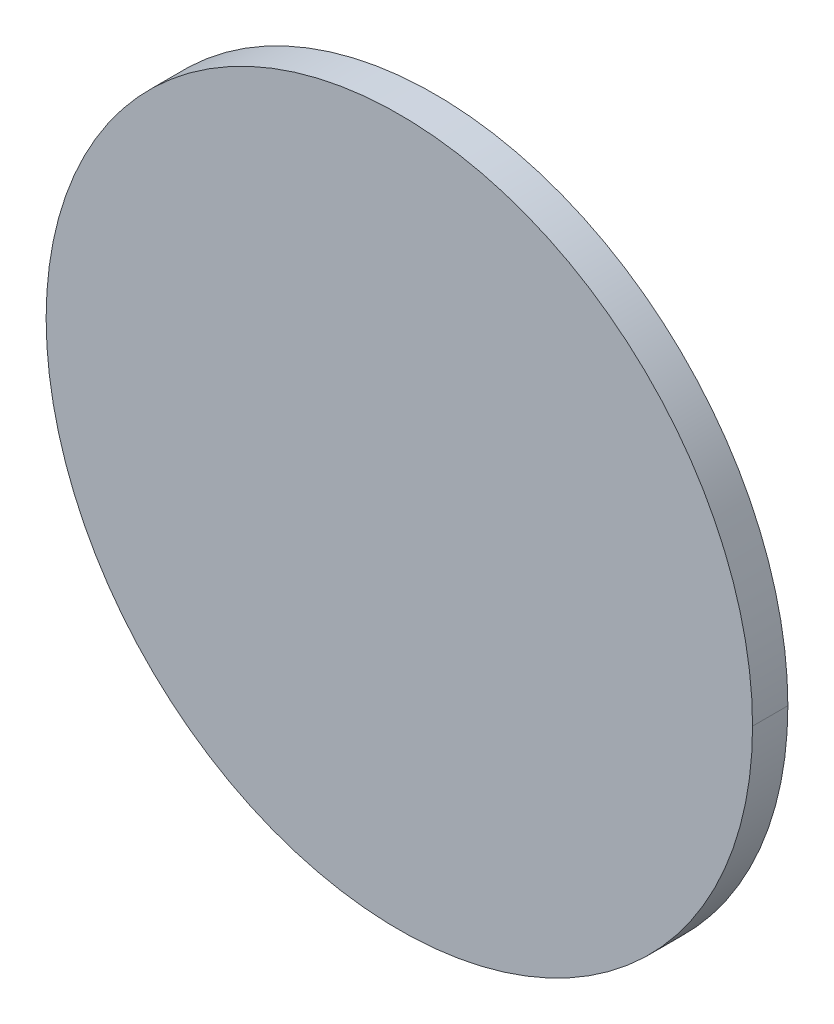
ISO-10303-21;
HEADER;
FILE_DESCRIPTION(('STEP AP214'),'2;1');
FILE_NAME('part.step','',(''),(''),'','','');
FILE_SCHEMA(('AUTOMOTIVE_DESIGN { 1 0 10303 214 1 1 1 1 }'));
ENDSEC;
DATA;
#1=APPLICATION_CONTEXT('core data for automotive mechanical design processes');
#2=APPLICATION_PROTOCOL_DEFINITION('international standard','automotive_design',2000,#1);
#3=PRODUCT_CONTEXT('',#1,'mechanical');
#4=PRODUCT('Part','Part','',(#3));
#5=PRODUCT_RELATED_PRODUCT_CATEGORY('part','',(#4));
#6=PRODUCT_DEFINITION_FORMATION('','',#4);
#7=PRODUCT_DEFINITION_CONTEXT('part definition',#1,'design');
#8=PRODUCT_DEFINITION('design','',#6,#7);
#9=PRODUCT_DEFINITION_SHAPE('','',#8);
#10=(LENGTH_UNIT() NAMED_UNIT(*) SI_UNIT(.MILLI.,.METRE.));
#11=(NAMED_UNIT(*) PLANE_ANGLE_UNIT() SI_UNIT($,.RADIAN.));
#12=(NAMED_UNIT(*) SI_UNIT($,.STERADIAN.) SOLID_ANGLE_UNIT());
#13=UNCERTAINTY_MEASURE_WITH_UNIT(LENGTH_MEASURE(1.E-05),#10,'distance_accuracy_value','');
#14=(GEOMETRIC_REPRESENTATION_CONTEXT(3) GLOBAL_UNCERTAINTY_ASSIGNED_CONTEXT((#13)) GLOBAL_UNIT_ASSIGNED_CONTEXT((#10,
#11,#12)) REPRESENTATION_CONTEXT('',''));
#15=CARTESIAN_POINT('',(0.,0.,0.));
#16=DIRECTION('',(0.,0.,1.));
#17=DIRECTION('',(1.,0.,0.));
#18=AXIS2_PLACEMENT_3D('',#15,#16,#17);
#19=CARTESIAN_POINT('',(0.,0.,0.));
#20=DIRECTION('',(0.,0.,-1.));
#21=DIRECTION('',(1.,0.,0.));
#22=AXIS2_PLACEMENT_3D('',#19,#20,#21);
#23=CYLINDRICAL_SURFACE('',#22,0.0999998);
#24=DIRECTION('',(0.,0.,-1.));
#25=VECTOR('',#24,1.);
#26=CARTESIAN_POINT('',(-0.0999998,0.,0.));
#27=LINE('',#26,#25);
#28=CARTESIAN_POINT('',(-0.0999998,0.,0.00999998));
#29=VERTEX_POINT('',#28);
#30=CARTESIAN_POINT('',(-0.0999998,0.,0.));
#31=VERTEX_POINT('',#30);
#32=EDGE_CURVE('E60',#29,#31,#27,.T.);
#33=ORIENTED_EDGE('',*,*,#32,.F.);
#34=CARTESIAN_POINT('',(0.,0.,0.00999998));
#35=DIRECTION('',(0.,0.,1.));
#36=DIRECTION('',(1.,0.,0.));
#37=AXIS2_PLACEMENT_3D('',#34,#35,#36);
#38=CIRCLE('',#37,0.0999998);
#39=CARTESIAN_POINT('',(0.0999998,0.,0.00999998));
#40=VERTEX_POINT('',#39);
#41=EDGE_CURVE('E26',#40,#29,#38,.T.);
#42=ORIENTED_EDGE('',*,*,#41,.F.);
#43=DIRECTION('',(0.,0.,-1.));
#44=VECTOR('',#43,1.);
#45=CARTESIAN_POINT('',(0.0999998,0.,0.));
#46=LINE('',#45,#44);
#47=CARTESIAN_POINT('',(0.0999998,0.,0.));
#48=VERTEX_POINT('',#47);
#49=EDGE_CURVE('E57',#40,#48,#46,.T.);
#50=ORIENTED_EDGE('',*,*,#49,.T.);
#51=CARTESIAN_POINT('',(0.,0.,0.));
#52=DIRECTION('',(0.,0.,1.));
#53=DIRECTION('',(1.,0.,0.));
#54=AXIS2_PLACEMENT_3D('',#51,#52,#53);
#55=CIRCLE('',#54,0.0999998);
#56=EDGE_CURVE('E11',#48,#31,#55,.T.);
#57=ORIENTED_EDGE('',*,*,#56,.T.);
#58=EDGE_LOOP('',(#33,#42,#50,#57));
#59=FACE_BOUND('',#58,.T.);
#60=ADVANCED_FACE('F16',(#59),#23,.T.);
#61=CARTESIAN_POINT('',(0.0999998,0.,0.));
#62=DIRECTION('',(0.,0.,-1.));
#63=DIRECTION('',(0.,-1.,0.));
#64=AXIS2_PLACEMENT_3D('',#61,#62,#63);
#65=PLANE('',#64);
#66=ORIENTED_EDGE('',*,*,#56,.F.);
#67=CARTESIAN_POINT('',(0.,0.,0.));
#68=DIRECTION('',(0.,0.,1.));
#69=DIRECTION('',(1.,0.,0.));
#70=AXIS2_PLACEMENT_3D('',#67,#68,#69);
#71=CIRCLE('',#70,0.0999998);
#72=EDGE_CURVE('E64',#31,#48,#71,.T.);
#73=ORIENTED_EDGE('',*,*,#72,.F.);
#74=EDGE_LOOP('',(#66,#73));
#75=FACE_BOUND('',#74,.T.);
#76=ADVANCED_FACE('F77',(#75),#65,.T.);
#77=CARTESIAN_POINT('',(0.0999998,0.,0.00999998));
#78=DIRECTION('',(0.,0.,-1.));
#79=DIRECTION('',(0.,-1.,0.));
#80=AXIS2_PLACEMENT_3D('',#77,#78,#79);
#81=PLANE('',#80);
#82=ORIENTED_EDGE('',*,*,#41,.T.);
#83=CARTESIAN_POINT('',(0.,0.,0.00999998));
#84=DIRECTION('',(0.,0.,1.));
#85=DIRECTION('',(1.,0.,0.));
#86=AXIS2_PLACEMENT_3D('',#83,#84,#85);
#87=CIRCLE('',#86,0.0999998);
#88=EDGE_CURVE('E55',#29,#40,#87,.T.);
#89=ORIENTED_EDGE('',*,*,#88,.T.);
#90=EDGE_LOOP('',(#82,#89));
#91=FACE_BOUND('',#90,.T.);
#92=ADVANCED_FACE('F18',(#91),#81,.F.);
#93=CARTESIAN_POINT('',(0.,0.,0.));
#94=DIRECTION('',(0.,0.,-1.));
#95=DIRECTION('',(1.,0.,0.));
#96=AXIS2_PLACEMENT_3D('',#93,#94,#95);
#97=CYLINDRICAL_SURFACE('',#96,0.0999998);
#98=ORIENTED_EDGE('',*,*,#88,.F.);
#99=ORIENTED_EDGE('',*,*,#32,.T.);
#100=ORIENTED_EDGE('',*,*,#72,.T.);
#101=ORIENTED_EDGE('',*,*,#49,.F.);
#102=EDGE_LOOP('',(#98,#99,#100,#101));
#103=FACE_BOUND('',#102,.T.);
#104=ADVANCED_FACE('F65',(#103),#97,.T.);
#105=CLOSED_SHELL('',(#60,#76,#92,#104));
#106=MANIFOLD_SOLID_BREP('B1',#105);
#107=ADVANCED_BREP_SHAPE_REPRESENTATION('',(#18,#106),#14);
#108=SHAPE_DEFINITION_REPRESENTATION(#9,#107);
ENDSEC;
END-ISO-10303-21;
